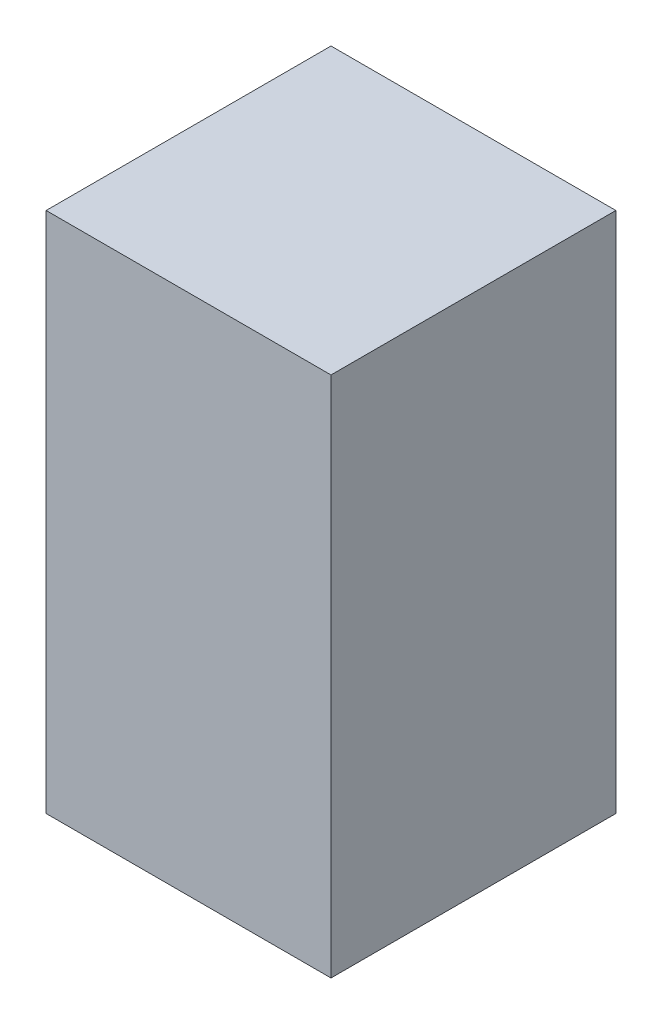
ISO-10303-21;
HEADER;
FILE_DESCRIPTION(('STEP AP214'),'2;1');
FILE_NAME('part.step','',(''),(''),'','','');
FILE_SCHEMA(('AUTOMOTIVE_DESIGN { 1 0 10303 214 1 1 1 1 }'));
ENDSEC;
DATA;
#1=APPLICATION_CONTEXT('core data for automotive mechanical design processes');
#2=APPLICATION_PROTOCOL_DEFINITION('international standard','automotive_design',2000,#1);
#3=PRODUCT_CONTEXT('',#1,'mechanical');
#4=PRODUCT('Part','Part','',(#3));
#5=PRODUCT_RELATED_PRODUCT_CATEGORY('part','',(#4));
#6=PRODUCT_DEFINITION_FORMATION('','',#4);
#7=PRODUCT_DEFINITION_CONTEXT('part definition',#1,'design');
#8=PRODUCT_DEFINITION('design','',#6,#7);
#9=PRODUCT_DEFINITION_SHAPE('','',#8);
#10=(LENGTH_UNIT() NAMED_UNIT(*) SI_UNIT(.MILLI.,.METRE.));
#11=(NAMED_UNIT(*) PLANE_ANGLE_UNIT() SI_UNIT($,.RADIAN.));
#12=(NAMED_UNIT(*) SI_UNIT($,.STERADIAN.) SOLID_ANGLE_UNIT());
#13=UNCERTAINTY_MEASURE_WITH_UNIT(LENGTH_MEASURE(1.E-05),#10,'distance_accuracy_value','');
#14=(GEOMETRIC_REPRESENTATION_CONTEXT(3) GLOBAL_UNCERTAINTY_ASSIGNED_CONTEXT((#13)) GLOBAL_UNIT_ASSIGNED_CONTEXT((#10,
#11,#12)) REPRESENTATION_CONTEXT('',''));
#15=CARTESIAN_POINT('',(0.,0.,0.));
#16=DIRECTION('',(0.,0.,1.));
#17=DIRECTION('',(1.,0.,0.));
#18=AXIS2_PLACEMENT_3D('',#15,#16,#17);
#19=CARTESIAN_POINT('',(0.,22.,0.));
#20=DIRECTION('',(1.,0.,0.));
#21=DIRECTION('',(0.,0.,-1.));
#22=AXIS2_PLACEMENT_3D('',#19,#20,#21);
#23=PLANE('',#22);
#24=DIRECTION('',(0.,0.,1.));
#25=VECTOR('',#24,1.);
#26=CARTESIAN_POINT('',(0.,0.,0.));
#27=LINE('',#26,#25);
#28=CARTESIAN_POINT('',(0.,0.,-12.));
#29=VERTEX_POINT('',#28);
#30=CARTESIAN_POINT('',(0.,0.,0.));
#31=VERTEX_POINT('',#30);
#32=EDGE_CURVE('E96',#29,#31,#27,.T.);
#33=ORIENTED_EDGE('',*,*,#32,.T.);
#34=DIRECTION('',(0.,-1.,0.));
#35=VECTOR('',#34,1.);
#36=CARTESIAN_POINT('',(0.,22.,0.));
#37=LINE('',#36,#35);
#38=CARTESIAN_POINT('',(0.,22.,0.));
#39=VERTEX_POINT('',#38);
#40=EDGE_CURVE('E11',#39,#31,#37,.T.);
#41=ORIENTED_EDGE('',*,*,#40,.F.);
#42=DIRECTION('',(0.,0.,1.));
#43=VECTOR('',#42,1.);
#44=CARTESIAN_POINT('',(0.,22.,0.));
#45=LINE('',#44,#43);
#46=CARTESIAN_POINT('',(0.,22.,-12.));
#47=VERTEX_POINT('',#46);
#48=EDGE_CURVE('E84',#47,#39,#45,.T.);
#49=ORIENTED_EDGE('',*,*,#48,.F.);
#50=DIRECTION('',(0.,-1.,0.));
#51=VECTOR('',#50,1.);
#52=CARTESIAN_POINT('',(0.,22.,-12.));
#53=LINE('',#52,#51);
#54=EDGE_CURVE('E92',#47,#29,#53,.T.);
#55=ORIENTED_EDGE('',*,*,#54,.T.);
#56=EDGE_LOOP('',(#33,#41,#49,#55));
#57=FACE_BOUND('',#56,.T.);
#58=ADVANCED_FACE('F33',(#57),#23,.F.);
#59=CARTESIAN_POINT('',(0.,22.,0.));
#60=DIRECTION('',(0.,0.,-1.));
#61=DIRECTION('',(-1.,0.,0.));
#62=AXIS2_PLACEMENT_3D('',#59,#60,#61);
#63=PLANE('',#62);
#64=DIRECTION('',(1.,0.,0.));
#65=VECTOR('',#64,1.);
#66=CARTESIAN_POINT('',(0.,0.,0.));
#67=LINE('',#66,#65);
#68=CARTESIAN_POINT('',(12.,0.,0.));
#69=VERTEX_POINT('',#68);
#70=EDGE_CURVE('E88',#31,#69,#67,.T.);
#71=ORIENTED_EDGE('',*,*,#70,.T.);
#72=DIRECTION('',(0.,-1.,0.));
#73=VECTOR('',#72,1.);
#74=CARTESIAN_POINT('',(12.,22.,0.));
#75=LINE('',#74,#73);
#76=CARTESIAN_POINT('',(12.,22.,0.));
#77=VERTEX_POINT('',#76);
#78=EDGE_CURVE('E41',#77,#69,#75,.T.);
#79=ORIENTED_EDGE('',*,*,#78,.F.);
#80=DIRECTION('',(1.,0.,0.));
#81=VECTOR('',#80,1.);
#82=CARTESIAN_POINT('',(0.,22.,0.));
#83=LINE('',#82,#81);
#84=EDGE_CURVE('E79',#39,#77,#83,.T.);
#85=ORIENTED_EDGE('',*,*,#84,.F.);
#86=ORIENTED_EDGE('',*,*,#40,.T.);
#87=EDGE_LOOP('',(#71,#79,#85,#86));
#88=FACE_BOUND('',#87,.T.);
#89=ADVANCED_FACE('F87',(#88),#63,.F.);
#90=CARTESIAN_POINT('',(12.,22.,0.));
#91=DIRECTION('',(-1.,0.,0.));
#92=DIRECTION('',(0.,0.,1.));
#93=AXIS2_PLACEMENT_3D('',#90,#91,#92);
#94=PLANE('',#93);
#95=DIRECTION('',(0.,0.,-1.));
#96=VECTOR('',#95,1.);
#97=CARTESIAN_POINT('',(12.,0.,0.));
#98=LINE('',#97,#96);
#99=CARTESIAN_POINT('',(12.,0.,-12.));
#100=VERTEX_POINT('',#99);
#101=EDGE_CURVE('E66',#69,#100,#98,.T.);
#102=ORIENTED_EDGE('',*,*,#101,.T.);
#103=DIRECTION('',(0.,-1.,0.));
#104=VECTOR('',#103,1.);
#105=CARTESIAN_POINT('',(12.,22.,-12.));
#106=LINE('',#105,#104);
#107=CARTESIAN_POINT('',(12.,22.,-12.));
#108=VERTEX_POINT('',#107);
#109=EDGE_CURVE('E89',#108,#100,#106,.T.);
#110=ORIENTED_EDGE('',*,*,#109,.F.);
#111=DIRECTION('',(0.,0.,-1.));
#112=VECTOR('',#111,1.);
#113=CARTESIAN_POINT('',(12.,22.,0.));
#114=LINE('',#113,#112);
#115=EDGE_CURVE('E82',#77,#108,#114,.T.);
#116=ORIENTED_EDGE('',*,*,#115,.F.);
#117=ORIENTED_EDGE('',*,*,#78,.T.);
#118=EDGE_LOOP('',(#102,#110,#116,#117));
#119=FACE_BOUND('',#118,.T.);
#120=ADVANCED_FACE('F90',(#119),#94,.F.);
#121=CARTESIAN_POINT('',(0.,22.,-12.));
#122=DIRECTION('',(0.,0.,1.));
#123=DIRECTION('',(1.,0.,0.));
#124=AXIS2_PLACEMENT_3D('',#121,#122,#123);
#125=PLANE('',#124);
#126=DIRECTION('',(-1.,0.,0.));
#127=VECTOR('',#126,1.);
#128=CARTESIAN_POINT('',(0.,0.,-12.));
#129=LINE('',#128,#127);
#130=EDGE_CURVE('E72',#100,#29,#129,.T.);
#131=ORIENTED_EDGE('',*,*,#130,.T.);
#132=ORIENTED_EDGE('',*,*,#54,.F.);
#133=DIRECTION('',(-1.,0.,0.));
#134=VECTOR('',#133,1.);
#135=CARTESIAN_POINT('',(0.,22.,-12.));
#136=LINE('',#135,#134);
#137=EDGE_CURVE('E49',#108,#47,#136,.T.);
#138=ORIENTED_EDGE('',*,*,#137,.F.);
#139=ORIENTED_EDGE('',*,*,#109,.T.);
#140=EDGE_LOOP('',(#131,#132,#138,#139));
#141=FACE_BOUND('',#140,.T.);
#142=ADVANCED_FACE('F103',(#141),#125,.F.);
#143=CARTESIAN_POINT('',(0.,22.,0.));
#144=DIRECTION('',(0.,-1.,0.));
#145=DIRECTION('',(0.,0.,-1.));
#146=AXIS2_PLACEMENT_3D('',#143,#144,#145);
#147=PLANE('',#146);
#148=ORIENTED_EDGE('',*,*,#48,.T.);
#149=ORIENTED_EDGE('',*,*,#84,.T.);
#150=ORIENTED_EDGE('',*,*,#115,.T.);
#151=ORIENTED_EDGE('',*,*,#137,.T.);
#152=EDGE_LOOP('',(#148,#149,#150,#151));
#153=FACE_BOUND('',#152,.T.);
#154=ADVANCED_FACE('F80',(#153),#147,.F.);
#155=CARTESIAN_POINT('',(0.,0.,0.));
#156=DIRECTION('',(0.,-1.,0.));
#157=DIRECTION('',(0.,0.,-1.));
#158=AXIS2_PLACEMENT_3D('',#155,#156,#157);
#159=PLANE('',#158);
#160=ORIENTED_EDGE('',*,*,#32,.F.);
#161=ORIENTED_EDGE('',*,*,#130,.F.);
#162=ORIENTED_EDGE('',*,*,#101,.F.);
#163=ORIENTED_EDGE('',*,*,#70,.F.);
#164=EDGE_LOOP('',(#160,#161,#162,#163));
#165=FACE_BOUND('',#164,.T.);
#166=ADVANCED_FACE('F106',(#165),#159,.T.);
#167=CLOSED_SHELL('',(#58,#89,#120,#142,#154,#166));
#168=MANIFOLD_SOLID_BREP('B2',#167);
#169=ADVANCED_BREP_SHAPE_REPRESENTATION('',(#18,#168),#14);
#170=SHAPE_DEFINITION_REPRESENTATION(#9,#169);
ENDSEC;
END-ISO-10303-21;
